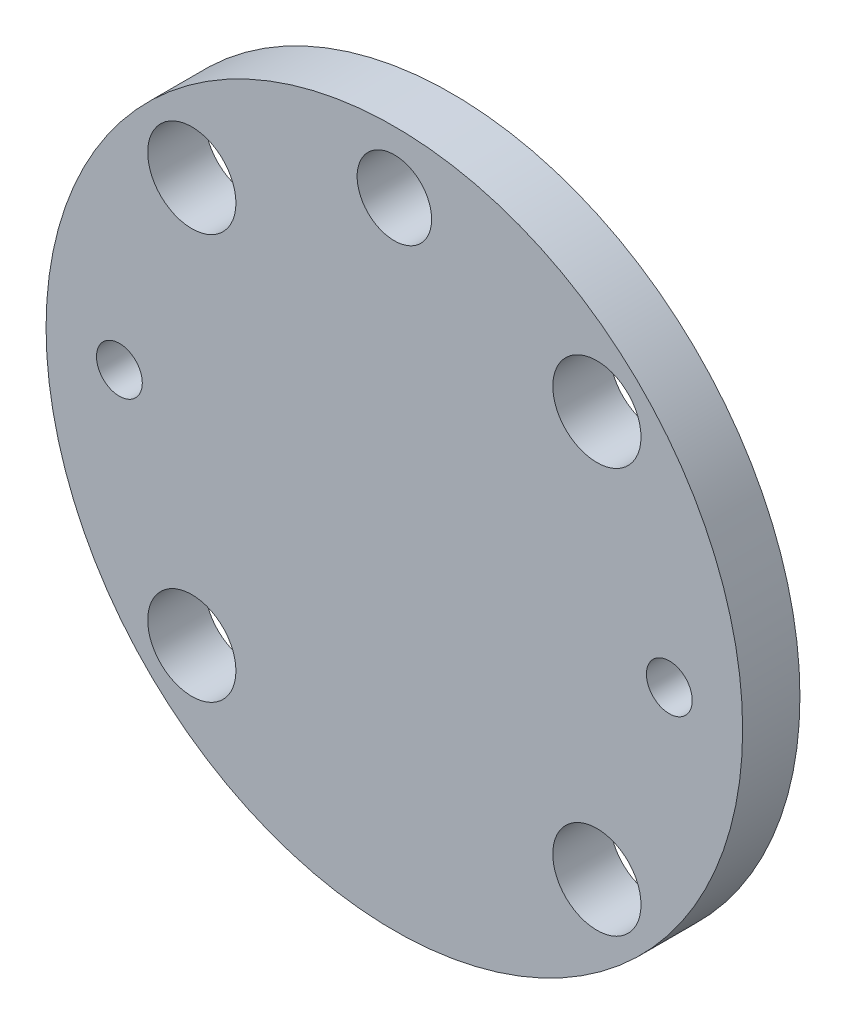
ISO-10303-21;
HEADER;
FILE_DESCRIPTION(('STEP AP214'),'2;1');
FILE_NAME('part.step','',(''),(''),'','','');
FILE_SCHEMA(('AUTOMOTIVE_DESIGN { 1 0 10303 214 1 1 1 1 }'));
ENDSEC;
DATA;
#1=APPLICATION_CONTEXT('core data for automotive mechanical design processes');
#2=APPLICATION_PROTOCOL_DEFINITION('international standard','automotive_design',2000,#1);
#3=PRODUCT_CONTEXT('',#1,'mechanical');
#4=PRODUCT('Part','Part','',(#3));
#5=PRODUCT_RELATED_PRODUCT_CATEGORY('part','',(#4));
#6=PRODUCT_DEFINITION_FORMATION('','',#4);
#7=PRODUCT_DEFINITION_CONTEXT('part definition',#1,'design');
#8=PRODUCT_DEFINITION('design','',#6,#7);
#9=PRODUCT_DEFINITION_SHAPE('','',#8);
#10=(LENGTH_UNIT() NAMED_UNIT(*) SI_UNIT(.MILLI.,.METRE.));
#11=(NAMED_UNIT(*) PLANE_ANGLE_UNIT() SI_UNIT($,.RADIAN.));
#12=(NAMED_UNIT(*) SI_UNIT($,.STERADIAN.) SOLID_ANGLE_UNIT());
#13=UNCERTAINTY_MEASURE_WITH_UNIT(LENGTH_MEASURE(1.E-05),#10,'distance_accuracy_value','');
#14=(GEOMETRIC_REPRESENTATION_CONTEXT(3) GLOBAL_UNCERTAINTY_ASSIGNED_CONTEXT((#13)) GLOBAL_UNIT_ASSIGNED_CONTEXT((#10,
#11,#12)) REPRESENTATION_CONTEXT('',''));
#15=CARTESIAN_POINT('',(0.,0.,0.));
#16=DIRECTION('',(0.,0.,1.));
#17=DIRECTION('',(1.,0.,0.));
#18=AXIS2_PLACEMENT_3D('',#15,#16,#17);
#19=CARTESIAN_POINT('',(0.,0.,5.));
#20=DIRECTION('',(0.,0.,-1.));
#21=DIRECTION('',(-1.,0.,0.));
#22=AXIS2_PLACEMENT_3D('',#19,#20,#21);
#23=CYLINDRICAL_SURFACE('',#22,30.4);
#24=CARTESIAN_POINT('',(0.,0.,5.));
#25=DIRECTION('',(0.,0.,1.));
#26=DIRECTION('',(1.,0.,0.));
#27=AXIS2_PLACEMENT_3D('',#24,#25,#26);
#28=CIRCLE('',#27,30.4);
#29=CARTESIAN_POINT('',(30.4,0.,5.));
#30=VERTEX_POINT('',#29);
#31=EDGE_CURVE('E52',#30,#30,#28,.T.);
#32=ORIENTED_EDGE('',*,*,#31,.F.);
#33=EDGE_LOOP('',(#32));
#34=FACE_BOUND('',#33,.T.);
#35=CARTESIAN_POINT('',(0.,0.,0.));
#36=DIRECTION('',(0.,0.,1.));
#37=DIRECTION('',(1.,0.,0.));
#38=AXIS2_PLACEMENT_3D('',#35,#36,#37);
#39=CIRCLE('',#38,30.4);
#40=CARTESIAN_POINT('',(30.4,0.,0.));
#41=VERTEX_POINT('',#40);
#42=EDGE_CURVE('E85',#41,#41,#39,.T.);
#43=ORIENTED_EDGE('',*,*,#42,.T.);
#44=EDGE_LOOP('',(#43));
#45=FACE_BOUND('',#44,.T.);
#46=ADVANCED_FACE('F43',(#34,#45),#23,.T.);
#47=CARTESIAN_POINT('',(17.6776695296636,17.6776695296637,5.));
#48=DIRECTION('',(0.,0.,-1.));
#49=DIRECTION('',(-1.,0.,0.));
#50=AXIS2_PLACEMENT_3D('',#47,#48,#49);
#51=CYLINDRICAL_SURFACE('',#50,3.85000000000008);
#52=CARTESIAN_POINT('',(17.6776695296636,17.6776695296637,5.));
#53=DIRECTION('',(0.,0.,1.));
#54=DIRECTION('',(1.,0.,0.));
#55=AXIS2_PLACEMENT_3D('',#52,#53,#54);
#56=CIRCLE('',#55,3.85000000000008);
#57=CARTESIAN_POINT('',(21.5276695296637,17.6776695296637,5.));
#58=VERTEX_POINT('',#57);
#59=EDGE_CURVE('E58',#58,#58,#56,.T.);
#60=ORIENTED_EDGE('',*,*,#59,.T.);
#61=EDGE_LOOP('',(#60));
#62=FACE_BOUND('',#61,.T.);
#63=CARTESIAN_POINT('',(17.6776695296636,17.6776695296637,0.));
#64=DIRECTION('',(0.,0.,1.));
#65=DIRECTION('',(1.,0.,0.));
#66=AXIS2_PLACEMENT_3D('',#63,#64,#65);
#67=CIRCLE('',#66,3.85000000000008);
#68=CARTESIAN_POINT('',(21.5276695296637,17.6776695296637,0.));
#69=VERTEX_POINT('',#68);
#70=EDGE_CURVE('E82',#69,#69,#67,.T.);
#71=ORIENTED_EDGE('',*,*,#70,.F.);
#72=EDGE_LOOP('',(#71));
#73=FACE_BOUND('',#72,.T.);
#74=ADVANCED_FACE('F120',(#62,#73),#51,.F.);
#75=CARTESIAN_POINT('',(17.6776695296637,-17.6776695296637,5.));
#76=DIRECTION('',(0.,0.,-1.));
#77=DIRECTION('',(-1.,0.,0.));
#78=AXIS2_PLACEMENT_3D('',#75,#76,#77);
#79=CYLINDRICAL_SURFACE('',#78,3.85000000000002);
#80=CARTESIAN_POINT('',(17.6776695296637,-17.6776695296637,5.));
#81=DIRECTION('',(0.,0.,1.));
#82=DIRECTION('',(1.,0.,0.));
#83=AXIS2_PLACEMENT_3D('',#80,#81,#82);
#84=CIRCLE('',#83,3.85000000000002);
#85=CARTESIAN_POINT('',(21.5276695296638,-17.6776695296637,5.));
#86=VERTEX_POINT('',#85);
#87=EDGE_CURVE('E113',#86,#86,#84,.T.);
#88=ORIENTED_EDGE('',*,*,#87,.T.);
#89=EDGE_LOOP('',(#88));
#90=FACE_BOUND('',#89,.T.);
#91=CARTESIAN_POINT('',(17.6776695296637,-17.6776695296637,0.));
#92=DIRECTION('',(0.,0.,1.));
#93=DIRECTION('',(1.,0.,0.));
#94=AXIS2_PLACEMENT_3D('',#91,#92,#93);
#95=CIRCLE('',#94,3.85000000000002);
#96=CARTESIAN_POINT('',(21.5276695296638,-17.6776695296637,0.));
#97=VERTEX_POINT('',#96);
#98=EDGE_CURVE('E78',#97,#97,#95,.T.);
#99=ORIENTED_EDGE('',*,*,#98,.F.);
#100=EDGE_LOOP('',(#99));
#101=FACE_BOUND('',#100,.T.);
#102=ADVANCED_FACE('F137',(#90,#101),#79,.F.);
#103=CARTESIAN_POINT('',(-17.6776695296636,-17.6776695296637,5.));
#104=DIRECTION('',(0.,0.,-1.));
#105=DIRECTION('',(-1.,0.,0.));
#106=AXIS2_PLACEMENT_3D('',#103,#104,#105);
#107=CYLINDRICAL_SURFACE('',#106,3.85000000000004);
#108=CARTESIAN_POINT('',(-17.6776695296636,-17.6776695296637,5.));
#109=DIRECTION('',(0.,0.,1.));
#110=DIRECTION('',(1.,0.,0.));
#111=AXIS2_PLACEMENT_3D('',#108,#109,#110);
#112=CIRCLE('',#111,3.85000000000004);
#113=CARTESIAN_POINT('',(-13.8276695296636,-17.6776695296637,5.));
#114=VERTEX_POINT('',#113);
#115=EDGE_CURVE('E109',#114,#114,#112,.T.);
#116=ORIENTED_EDGE('',*,*,#115,.T.);
#117=EDGE_LOOP('',(#116));
#118=FACE_BOUND('',#117,.T.);
#119=CARTESIAN_POINT('',(-17.6776695296636,-17.6776695296637,0.));
#120=DIRECTION('',(0.,0.,1.));
#121=DIRECTION('',(1.,0.,0.));
#122=AXIS2_PLACEMENT_3D('',#119,#120,#121);
#123=CIRCLE('',#122,3.85000000000004);
#124=CARTESIAN_POINT('',(-13.8276695296636,-17.6776695296637,0.));
#125=VERTEX_POINT('',#124);
#126=EDGE_CURVE('E74',#125,#125,#123,.T.);
#127=ORIENTED_EDGE('',*,*,#126,.F.);
#128=EDGE_LOOP('',(#127));
#129=FACE_BOUND('',#128,.T.);
#130=ADVANCED_FACE('F144',(#118,#129),#107,.F.);
#131=CARTESIAN_POINT('',(-17.6776695296637,17.6776695296637,5.));
#132=DIRECTION('',(0.,0.,-1.));
#133=DIRECTION('',(-1.,0.,0.));
#134=AXIS2_PLACEMENT_3D('',#131,#132,#133);
#135=CYLINDRICAL_SURFACE('',#134,3.84999999999993);
#136=CARTESIAN_POINT('',(-17.6776695296637,17.6776695296637,5.));
#137=DIRECTION('',(0.,0.,1.));
#138=DIRECTION('',(1.,0.,0.));
#139=AXIS2_PLACEMENT_3D('',#136,#137,#138);
#140=CIRCLE('',#139,3.84999999999993);
#141=CARTESIAN_POINT('',(-13.8276695296638,17.6776695296637,5.));
#142=VERTEX_POINT('',#141);
#143=EDGE_CURVE('E103',#142,#142,#140,.T.);
#144=ORIENTED_EDGE('',*,*,#143,.T.);
#145=EDGE_LOOP('',(#144));
#146=FACE_BOUND('',#145,.T.);
#147=CARTESIAN_POINT('',(-17.6776695296637,17.6776695296637,0.));
#148=DIRECTION('',(0.,0.,1.));
#149=DIRECTION('',(1.,0.,0.));
#150=AXIS2_PLACEMENT_3D('',#147,#148,#149);
#151=CIRCLE('',#150,3.84999999999993);
#152=CARTESIAN_POINT('',(-13.8276695296638,17.6776695296637,0.));
#153=VERTEX_POINT('',#152);
#154=EDGE_CURVE('E70',#153,#153,#151,.T.);
#155=ORIENTED_EDGE('',*,*,#154,.F.);
#156=EDGE_LOOP('',(#155));
#157=FACE_BOUND('',#156,.T.);
#158=ADVANCED_FACE('F148',(#146,#157),#135,.F.);
#159=CARTESIAN_POINT('',(0.,24.9999999999999,5.));
#160=DIRECTION('',(0.,0.,-1.));
#161=DIRECTION('',(-1.,0.,0.));
#162=AXIS2_PLACEMENT_3D('',#159,#160,#161);
#163=CYLINDRICAL_SURFACE('',#162,3.25000000000003);
#164=CARTESIAN_POINT('',(0.,24.9999999999999,5.));
#165=DIRECTION('',(0.,0.,1.));
#166=DIRECTION('',(1.,0.,0.));
#167=AXIS2_PLACEMENT_3D('',#164,#165,#166);
#168=CIRCLE('',#167,3.25000000000003);
#169=CARTESIAN_POINT('',(3.25000000000003,24.9999999999999,5.));
#170=VERTEX_POINT('',#169);
#171=EDGE_CURVE('E97',#170,#170,#168,.T.);
#172=ORIENTED_EDGE('',*,*,#171,.T.);
#173=EDGE_LOOP('',(#172));
#174=FACE_BOUND('',#173,.T.);
#175=CARTESIAN_POINT('',(0.,24.9999999999999,0.));
#176=DIRECTION('',(0.,0.,1.));
#177=DIRECTION('',(1.,0.,0.));
#178=AXIS2_PLACEMENT_3D('',#175,#176,#177);
#179=CIRCLE('',#178,3.25000000000003);
#180=CARTESIAN_POINT('',(3.25000000000003,24.9999999999999,0.));
#181=VERTEX_POINT('',#180);
#182=EDGE_CURVE('E66',#181,#181,#179,.T.);
#183=ORIENTED_EDGE('',*,*,#182,.F.);
#184=EDGE_LOOP('',(#183));
#185=FACE_BOUND('',#184,.T.);
#186=ADVANCED_FACE('F151',(#174,#185),#163,.F.);
#187=CARTESIAN_POINT('',(24.,0.,5.));
#188=DIRECTION('',(0.,0.,-1.));
#189=DIRECTION('',(-1.,0.,0.));
#190=AXIS2_PLACEMENT_3D('',#187,#188,#189);
#191=CYLINDRICAL_SURFACE('',#190,2.);
#192=CARTESIAN_POINT('',(24.,0.,5.));
#193=DIRECTION('',(0.,0.,1.));
#194=DIRECTION('',(1.,0.,0.));
#195=AXIS2_PLACEMENT_3D('',#192,#193,#194);
#196=CIRCLE('',#195,2.);
#197=CARTESIAN_POINT('',(26.,0.,5.));
#198=VERTEX_POINT('',#197);
#199=EDGE_CURVE('E92',#198,#198,#196,.T.);
#200=ORIENTED_EDGE('',*,*,#199,.T.);
#201=EDGE_LOOP('',(#200));
#202=FACE_BOUND('',#201,.T.);
#203=CARTESIAN_POINT('',(24.,0.,0.));
#204=DIRECTION('',(0.,0.,1.));
#205=DIRECTION('',(1.,0.,0.));
#206=AXIS2_PLACEMENT_3D('',#203,#204,#205);
#207=CIRCLE('',#206,2.);
#208=CARTESIAN_POINT('',(26.,0.,0.));
#209=VERTEX_POINT('',#208);
#210=EDGE_CURVE('E62',#209,#209,#207,.T.);
#211=ORIENTED_EDGE('',*,*,#210,.F.);
#212=EDGE_LOOP('',(#211));
#213=FACE_BOUND('',#212,.T.);
#214=ADVANCED_FACE('F45',(#202,#213),#191,.F.);
#215=CARTESIAN_POINT('',(-24.,0.,5.));
#216=DIRECTION('',(0.,0.,-1.));
#217=DIRECTION('',(-1.,0.,0.));
#218=AXIS2_PLACEMENT_3D('',#215,#216,#217);
#219=CYLINDRICAL_SURFACE('',#218,2.);
#220=CARTESIAN_POINT('',(-24.,0.,5.));
#221=DIRECTION('',(0.,0.,1.));
#222=DIRECTION('',(1.,0.,0.));
#223=AXIS2_PLACEMENT_3D('',#220,#221,#222);
#224=CIRCLE('',#223,2.);
#225=CARTESIAN_POINT('',(-22.,0.,5.));
#226=VERTEX_POINT('',#225);
#227=EDGE_CURVE('E10',#226,#226,#224,.F.);
#228=ORIENTED_EDGE('',*,*,#227,.F.);
#229=EDGE_LOOP('',(#228));
#230=FACE_BOUND('',#229,.T.);
#231=CARTESIAN_POINT('',(-24.,0.,0.));
#232=DIRECTION('',(0.,0.,1.));
#233=DIRECTION('',(1.,0.,0.));
#234=AXIS2_PLACEMENT_3D('',#231,#232,#233);
#235=CIRCLE('',#234,2.);
#236=CARTESIAN_POINT('',(-22.,0.,0.));
#237=VERTEX_POINT('',#236);
#238=EDGE_CURVE('E47',#237,#237,#235,.F.);
#239=ORIENTED_EDGE('',*,*,#238,.T.);
#240=EDGE_LOOP('',(#239));
#241=FACE_BOUND('',#240,.T.);
#242=ADVANCED_FACE('F127',(#230,#241),#219,.F.);
#243=CARTESIAN_POINT('',(0.,0.,5.));
#244=DIRECTION('',(0.,0.,1.));
#245=DIRECTION('',(1.,0.,0.));
#246=AXIS2_PLACEMENT_3D('',#243,#244,#245);
#247=PLANE('',#246);
#248=ORIENTED_EDGE('',*,*,#199,.F.);
#249=EDGE_LOOP('',(#248));
#250=FACE_BOUND('',#249,.T.);
#251=ORIENTED_EDGE('',*,*,#171,.F.);
#252=EDGE_LOOP('',(#251));
#253=FACE_BOUND('',#252,.T.);
#254=ORIENTED_EDGE('',*,*,#143,.F.);
#255=EDGE_LOOP('',(#254));
#256=FACE_BOUND('',#255,.T.);
#257=ORIENTED_EDGE('',*,*,#115,.F.);
#258=EDGE_LOOP('',(#257));
#259=FACE_BOUND('',#258,.T.);
#260=ORIENTED_EDGE('',*,*,#87,.F.);
#261=EDGE_LOOP('',(#260));
#262=FACE_BOUND('',#261,.T.);
#263=ORIENTED_EDGE('',*,*,#59,.F.);
#264=EDGE_LOOP('',(#263));
#265=FACE_BOUND('',#264,.T.);
#266=ORIENTED_EDGE('',*,*,#31,.T.);
#267=EDGE_LOOP('',(#266));
#268=FACE_BOUND('',#267,.T.);
#269=ORIENTED_EDGE('',*,*,#227,.T.);
#270=EDGE_LOOP('',(#269));
#271=FACE_BOUND('',#270,.T.);
#272=ADVANCED_FACE('F123',(#250,#253,#256,#259,#262,#265,#268,#271),#247,.T.);
#273=CARTESIAN_POINT('',(0.,0.,0.));
#274=DIRECTION('',(0.,0.,1.));
#275=DIRECTION('',(1.,0.,0.));
#276=AXIS2_PLACEMENT_3D('',#273,#274,#275);
#277=PLANE('',#276);
#278=ORIENTED_EDGE('',*,*,#210,.T.);
#279=EDGE_LOOP('',(#278));
#280=FACE_BOUND('',#279,.T.);
#281=ORIENTED_EDGE('',*,*,#182,.T.);
#282=EDGE_LOOP('',(#281));
#283=FACE_BOUND('',#282,.T.);
#284=ORIENTED_EDGE('',*,*,#154,.T.);
#285=EDGE_LOOP('',(#284));
#286=FACE_BOUND('',#285,.T.);
#287=ORIENTED_EDGE('',*,*,#126,.T.);
#288=EDGE_LOOP('',(#287));
#289=FACE_BOUND('',#288,.T.);
#290=ORIENTED_EDGE('',*,*,#98,.T.);
#291=EDGE_LOOP('',(#290));
#292=FACE_BOUND('',#291,.T.);
#293=ORIENTED_EDGE('',*,*,#70,.T.);
#294=EDGE_LOOP('',(#293));
#295=FACE_BOUND('',#294,.T.);
#296=ORIENTED_EDGE('',*,*,#42,.F.);
#297=EDGE_LOOP('',(#296));
#298=FACE_BOUND('',#297,.T.);
#299=ORIENTED_EDGE('',*,*,#238,.F.);
#300=EDGE_LOOP('',(#299));
#301=FACE_BOUND('',#300,.T.);
#302=ADVANCED_FACE('F126',(#280,#283,#286,#289,#292,#295,#298,#301),#277,.F.);
#303=CLOSED_SHELL('',(#46,#74,#102,#130,#158,#186,#214,#242,#272,#302));
#304=MANIFOLD_SOLID_BREP('B2',#303);
#305=ADVANCED_BREP_SHAPE_REPRESENTATION('',(#18,#304),#14);
#306=SHAPE_DEFINITION_REPRESENTATION(#9,#305);
ENDSEC;
END-ISO-10303-21;
